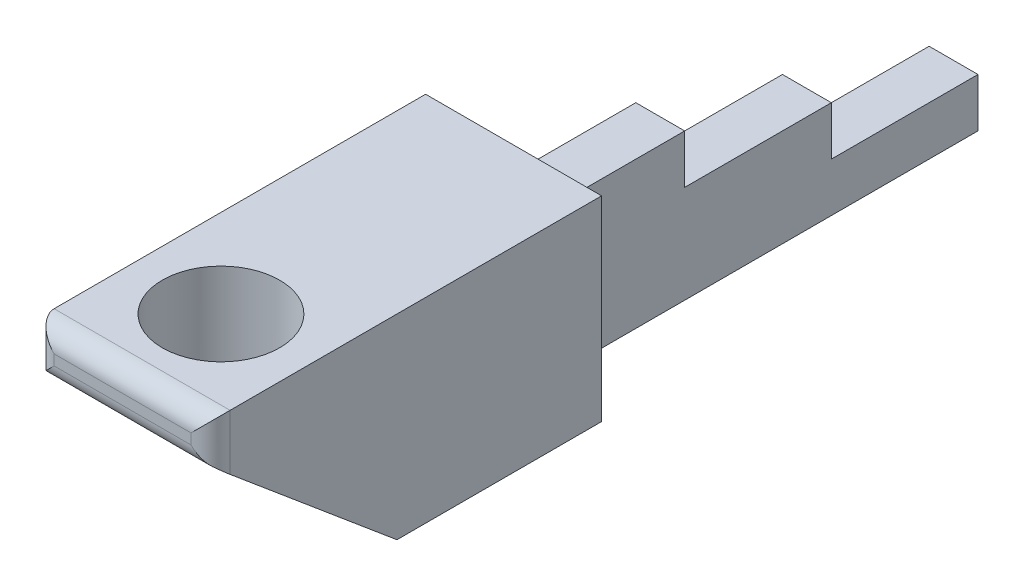
ISO-10303-21;
HEADER;
FILE_DESCRIPTION(('STEP AP214'),'2;1');
FILE_NAME('part.step','',(''),(''),'','','');
FILE_SCHEMA(('AUTOMOTIVE_DESIGN { 1 0 10303 214 1 1 1 1 }'));
ENDSEC;
DATA;
#1=APPLICATION_CONTEXT('core data for automotive mechanical design processes');
#2=APPLICATION_PROTOCOL_DEFINITION('international standard','automotive_design',2000,#1);
#3=PRODUCT_CONTEXT('',#1,'mechanical');
#4=PRODUCT('Part','Part','',(#3));
#5=PRODUCT_RELATED_PRODUCT_CATEGORY('part','',(#4));
#6=PRODUCT_DEFINITION_FORMATION('','',#4);
#7=PRODUCT_DEFINITION_CONTEXT('part definition',#1,'design');
#8=PRODUCT_DEFINITION('design','',#6,#7);
#9=PRODUCT_DEFINITION_SHAPE('','',#8);
#10=(LENGTH_UNIT() NAMED_UNIT(*) SI_UNIT(.MILLI.,.METRE.));
#11=(NAMED_UNIT(*) PLANE_ANGLE_UNIT() SI_UNIT($,.RADIAN.));
#12=(NAMED_UNIT(*) SI_UNIT($,.STERADIAN.) SOLID_ANGLE_UNIT());
#13=UNCERTAINTY_MEASURE_WITH_UNIT(LENGTH_MEASURE(1.E-05),#10,'distance_accuracy_value','');
#14=(GEOMETRIC_REPRESENTATION_CONTEXT(3) GLOBAL_UNCERTAINTY_ASSIGNED_CONTEXT((#13)) GLOBAL_UNIT_ASSIGNED_CONTEXT((#10,
#11,#12)) REPRESENTATION_CONTEXT('',''));
#15=CARTESIAN_POINT('',(0.,0.,0.));
#16=DIRECTION('',(0.,0.,1.));
#17=DIRECTION('',(1.,0.,0.));
#18=AXIS2_PLACEMENT_3D('',#15,#16,#17);
#19=CARTESIAN_POINT('',(9.,0.,-20.9319425184927));
#20=DIRECTION('',(0.,0.,-1.));
#21=DIRECTION('',(0.,1.,0.));
#22=AXIS2_PLACEMENT_3D('',#19,#20,#21);
#23=PLANE('',#22);
#24=DIRECTION('',(-1.,0.,0.));
#25=VECTOR('',#24,1.);
#26=CARTESIAN_POINT('',(2.5,15.,-20.9319425184927));
#27=LINE('',#26,#25);
#28=CARTESIAN_POINT('',(2.5,15.,-20.9319425184927));
#29=VERTEX_POINT('',#28);
#30=CARTESIAN_POINT('',(-2.5,15.,-20.9319425184927));
#31=VERTEX_POINT('',#30);
#32=EDGE_CURVE('E208',#29,#31,#27,.T.);
#33=ORIENTED_EDGE('',*,*,#32,.T.);
#34=DIRECTION('',(0.,-1.,0.));
#35=VECTOR('',#34,1.);
#36=CARTESIAN_POINT('',(-2.5,0.,-20.9319425184927));
#37=LINE('',#36,#35);
#38=CARTESIAN_POINT('',(-2.5,0.,-20.9319425184927));
#39=VERTEX_POINT('',#38);
#40=EDGE_CURVE('E180',#31,#39,#37,.T.);
#41=ORIENTED_EDGE('',*,*,#40,.T.);
#42=DIRECTION('',(-1.,0.,0.));
#43=VECTOR('',#42,1.);
#44=CARTESIAN_POINT('',(9.,0.,-20.9319425184927));
#45=LINE('',#44,#43);
#46=CARTESIAN_POINT('',(-9.,0.,-20.9319425184927));
#47=VERTEX_POINT('',#46);
#48=EDGE_CURVE('E290',#39,#47,#45,.T.);
#49=ORIENTED_EDGE('',*,*,#48,.T.);
#50=DIRECTION('',(0.,-1.,0.));
#51=VECTOR('',#50,1.);
#52=CARTESIAN_POINT('',(-9.,0.,-20.9319425184927));
#53=LINE('',#52,#51);
#54=CARTESIAN_POINT('',(-9.,20.,-20.9319425184927));
#55=VERTEX_POINT('',#54);
#56=EDGE_CURVE('E274',#55,#47,#53,.T.);
#57=ORIENTED_EDGE('',*,*,#56,.F.);
#58=DIRECTION('',(-1.,0.,0.));
#59=VECTOR('',#58,1.);
#60=CARTESIAN_POINT('',(9.,20.,-20.9319425184927));
#61=LINE('',#60,#59);
#62=CARTESIAN_POINT('',(9.,20.,-20.9319425184927));
#63=VERTEX_POINT('',#62);
#64=EDGE_CURVE('E286',#63,#55,#61,.T.);
#65=ORIENTED_EDGE('',*,*,#64,.F.);
#66=DIRECTION('',(0.,-1.,0.));
#67=VECTOR('',#66,1.);
#68=CARTESIAN_POINT('',(9.,0.,-20.9319425184927));
#69=LINE('',#68,#67);
#70=CARTESIAN_POINT('',(9.,0.,-20.9319425184927));
#71=VERTEX_POINT('',#70);
#72=EDGE_CURVE('E259',#63,#71,#69,.T.);
#73=ORIENTED_EDGE('',*,*,#72,.T.);
#74=CARTESIAN_POINT('',(2.5,0.,-20.9319425184927));
#75=VERTEX_POINT('',#74);
#76=EDGE_CURVE('E291',#71,#75,#45,.T.);
#77=ORIENTED_EDGE('',*,*,#76,.T.);
#78=DIRECTION('',(0.,-1.,0.));
#79=VECTOR('',#78,1.);
#80=CARTESIAN_POINT('',(2.5,0.,-20.9319425184927));
#81=LINE('',#80,#79);
#82=EDGE_CURVE('E178',#29,#75,#81,.T.);
#83=ORIENTED_EDGE('',*,*,#82,.F.);
#84=EDGE_LOOP('',(#33,#41,#49,#57,#65,#73,#77,#83));
#85=FACE_BOUND('',#84,.T.);
#86=ADVANCED_FACE('F41',(#85),#23,.T.);
#87=CARTESIAN_POINT('',(9.,0.,0.));
#88=DIRECTION('',(0.,-1.,0.));
#89=DIRECTION('',(0.,0.,-1.));
#90=AXIS2_PLACEMENT_3D('',#87,#88,#89);
#91=PLANE('',#90);
#92=DIRECTION('',(0.,0.,1.));
#93=VECTOR('',#92,1.);
#94=CARTESIAN_POINT('',(-9.,0.,0.));
#95=LINE('',#94,#93);
#96=CARTESIAN_POINT('',(-9.,0.,0.));
#97=VERTEX_POINT('',#96);
#98=EDGE_CURVE('E167',#47,#97,#95,.T.);
#99=ORIENTED_EDGE('',*,*,#98,.F.);
#100=ORIENTED_EDGE('',*,*,#48,.F.);
#101=DIRECTION('',(0.,0.,1.));
#102=VECTOR('',#101,1.);
#103=CARTESIAN_POINT('',(-2.5,0.,0.));
#104=LINE('',#103,#102);
#105=CARTESIAN_POINT('',(-2.5,0.,-65.9319425184927));
#106=VERTEX_POINT('',#105);
#107=EDGE_CURVE('E161',#106,#39,#104,.T.);
#108=ORIENTED_EDGE('',*,*,#107,.F.);
#109=DIRECTION('',(-1.,0.,0.));
#110=VECTOR('',#109,1.);
#111=CARTESIAN_POINT('',(2.5,0.,-65.9319425184927));
#112=LINE('',#111,#110);
#113=CARTESIAN_POINT('',(2.5,0.,-65.9319425184927));
#114=VERTEX_POINT('',#113);
#115=EDGE_CURVE('E154',#114,#106,#112,.T.);
#116=ORIENTED_EDGE('',*,*,#115,.F.);
#117=DIRECTION('',(0.,0.,1.));
#118=VECTOR('',#117,1.);
#119=CARTESIAN_POINT('',(2.5,0.,0.));
#120=LINE('',#119,#118);
#121=EDGE_CURVE('E158',#114,#75,#120,.T.);
#122=ORIENTED_EDGE('',*,*,#121,.T.);
#123=ORIENTED_EDGE('',*,*,#76,.F.);
#124=DIRECTION('',(0.,0.,1.));
#125=VECTOR('',#124,1.);
#126=CARTESIAN_POINT('',(9.,0.,0.));
#127=LINE('',#126,#125);
#128=CARTESIAN_POINT('',(9.,0.,0.));
#129=VERTEX_POINT('',#128);
#130=EDGE_CURVE('E255',#71,#129,#127,.T.);
#131=ORIENTED_EDGE('',*,*,#130,.T.);
#132=DIRECTION('',(-1.,0.,0.));
#133=VECTOR('',#132,1.);
#134=CARTESIAN_POINT('',(9.,0.,0.));
#135=LINE('',#134,#133);
#136=EDGE_CURVE('E270',#129,#97,#135,.T.);
#137=ORIENTED_EDGE('',*,*,#136,.T.);
#138=EDGE_LOOP('',(#99,#100,#108,#116,#122,#123,#131,#137));
#139=FACE_BOUND('',#138,.T.);
#140=ADVANCED_FACE('F157',(#139),#91,.T.);
#141=CARTESIAN_POINT('',(9.,20.,0.));
#142=DIRECTION('',(0.,1.,0.));
#143=DIRECTION('',(0.,0.,1.));
#144=AXIS2_PLACEMENT_3D('',#141,#142,#143);
#145=PLANE('',#144);
#146=CARTESIAN_POINT('',(0.,20.,9.));
#147=DIRECTION('',(0.,1.,0.));
#148=DIRECTION('',(0.,0.,1.));
#149=AXIS2_PLACEMENT_3D('',#146,#147,#148);
#150=CIRCLE('',#149,6.);
#151=CARTESIAN_POINT('',(0.,20.,15.));
#152=VERTEX_POINT('',#151);
#153=EDGE_CURVE('E298',#152,#152,#150,.T.);
#154=ORIENTED_EDGE('',*,*,#153,.F.);
#155=EDGE_LOOP('',(#154));
#156=FACE_BOUND('',#155,.T.);
#157=DIRECTION('',(0.,0.,-1.));
#158=VECTOR('',#157,1.);
#159=CARTESIAN_POINT('',(-9.,20.,0.));
#160=LINE('',#159,#158);
#161=CARTESIAN_POINT('',(-9.,20.,17.0680574815073));
#162=VERTEX_POINT('',#161);
#163=EDGE_CURVE('E278',#162,#55,#160,.T.);
#164=ORIENTED_EDGE('',*,*,#163,.F.);
#165=DIRECTION('',(-1.,0.,0.));
#166=VECTOR('',#165,1.);
#167=CARTESIAN_POINT('',(9.,20.,17.0680574815073));
#168=LINE('',#167,#166);
#169=CARTESIAN_POINT('',(9.,20.,17.0680574815073));
#170=VERTEX_POINT('',#169);
#171=EDGE_CURVE('E311',#162,#170,#168,.F.);
#172=ORIENTED_EDGE('',*,*,#171,.T.);
#173=DIRECTION('',(0.,0.,-1.));
#174=VECTOR('',#173,1.);
#175=CARTESIAN_POINT('',(9.,20.,0.));
#176=LINE('',#175,#174);
#177=EDGE_CURVE('E264',#170,#63,#176,.T.);
#178=ORIENTED_EDGE('',*,*,#177,.T.);
#179=ORIENTED_EDGE('',*,*,#64,.T.);
#180=EDGE_LOOP('',(#164,#172,#178,#179));
#181=FACE_BOUND('',#180,.T.);
#182=ADVANCED_FACE('F347',(#156,#181),#145,.T.);
#183=CARTESIAN_POINT('',(9.,0.,19.0680574815073));
#184=DIRECTION('',(0.,0.,1.));
#185=DIRECTION('',(1.,0.,0.));
#186=AXIS2_PLACEMENT_3D('',#183,#184,#185);
#187=PLANE('',#186);
#188=DIRECTION('',(0.,1.,0.));
#189=VECTOR('',#188,1.);
#190=CARTESIAN_POINT('',(7.,0.,19.0680574815073));
#191=LINE('',#190,#189);
#192=CARTESIAN_POINT('',(7.,16.93261531631,19.0680574815073));
#193=VERTEX_POINT('',#192);
#194=CARTESIAN_POINT('',(7.,18.,19.0680574815073));
#195=VERTEX_POINT('',#194);
#196=EDGE_CURVE('E304',#193,#195,#191,.T.);
#197=ORIENTED_EDGE('',*,*,#196,.T.);
#198=DIRECTION('',(-1.,0.,0.));
#199=VECTOR('',#198,1.);
#200=CARTESIAN_POINT('',(9.,18.,19.0680574815073));
#201=LINE('',#200,#199);
#202=CARTESIAN_POINT('',(-7.,18.,19.0680574815073));
#203=VERTEX_POINT('',#202);
#204=EDGE_CURVE('E307',#195,#203,#201,.T.);
#205=ORIENTED_EDGE('',*,*,#204,.T.);
#206=DIRECTION('',(0.,1.,0.));
#207=VECTOR('',#206,1.);
#208=CARTESIAN_POINT('',(-7.,16.,19.0680574815073));
#209=LINE('',#208,#207);
#210=CARTESIAN_POINT('',(-7.,16.93261531631,19.0680574815073));
#211=VERTEX_POINT('',#210);
#212=EDGE_CURVE('E294',#203,#211,#209,.F.);
#213=ORIENTED_EDGE('',*,*,#212,.T.);
#214=DIRECTION('',(-1.,0.,0.));
#215=VECTOR('',#214,1.);
#216=CARTESIAN_POINT('',(9.,16.93261531631,19.0680574815073));
#217=LINE('',#216,#215);
#218=EDGE_CURVE('E301',#211,#193,#217,.F.);
#219=ORIENTED_EDGE('',*,*,#218,.T.);
#220=EDGE_LOOP('',(#197,#205,#213,#219));
#221=FACE_BOUND('',#220,.T.);
#222=ADVANCED_FACE('F350',(#221),#187,.T.);
#223=CARTESIAN_POINT('',(9.,0.,0.));
#224=DIRECTION('',(0.,-0.766044443118977,0.64278760968654));
#225=DIRECTION('',(0.,-0.64278760968654,-0.766044443118977));
#226=AXIS2_PLACEMENT_3D('',#223,#224,#225);
#227=PLANE('',#226);
#228=CARTESIAN_POINT('',(0.,7.55189668059554,9.));
#229=DIRECTION('',(0.,-0.766044443118977,0.64278760968654));
#230=DIRECTION('',(0.,0.64278760968654,0.766044443118977));
#231=AXIS2_PLACEMENT_3D('',#228,#229,#230);
#232=ELLIPSE('',#231,7.83244373599368,6.);
#233=CARTESIAN_POINT('',(0.,12.5864944676592,15.));
#234=VERTEX_POINT('',#233);
#235=EDGE_CURVE('E212',#234,#234,#232,.T.);
#236=ORIENTED_EDGE('',*,*,#235,.F.);
#237=EDGE_LOOP('',(#236));
#238=FACE_BOUND('',#237,.T.);
#239=DIRECTION('',(0.,0.64278760968654,0.766044443118977));
#240=VECTOR('',#239,1.);
#241=CARTESIAN_POINT('',(9.,0.,0.));
#242=LINE('',#241,#240);
#243=CARTESIAN_POINT('',(9.,14.3218007376454,17.0680574815073));
#244=VERTEX_POINT('',#243);
#245=EDGE_CURVE('E267',#129,#244,#242,.T.);
#246=ORIENTED_EDGE('',*,*,#245,.T.);
#247=CARTESIAN_POINT('',(7.,14.3218007376454,17.0680574815073));
#248=DIRECTION('',(0.,-0.766044443118977,0.64278760968654));
#249=DIRECTION('',(0.,0.64278760968654,0.766044443118977));
#250=AXIS2_PLACEMENT_3D('',#247,#248,#249);
#251=ELLIPSE('',#250,2.61081457866456,2.);
#252=CARTESIAN_POINT('',(8.53208888623795,15.400526430072,18.3536327008804));
#253=VERTEX_POINT('',#252);
#254=EDGE_CURVE('E51',#244,#253,#251,.T.);
#255=ORIENTED_EDGE('',*,*,#254,.T.);
#256=DIRECTION('',(-1.,0.,0.));
#257=VECTOR('',#256,1.);
#258=CARTESIAN_POINT('',(9.,15.400526430072,18.3536327008804));
#259=LINE('',#258,#257);
#260=CARTESIAN_POINT('',(-8.53208888623795,15.400526430072,18.3536327008804));
#261=VERTEX_POINT('',#260);
#262=EDGE_CURVE('E62',#253,#261,#259,.T.);
#263=ORIENTED_EDGE('',*,*,#262,.T.);
#264=CARTESIAN_POINT('',(-7.,14.3218007376454,17.0680574815073));
#265=DIRECTION('',(0.,-0.766044443118977,0.64278760968654));
#266=DIRECTION('',(0.,-0.64278760968654,-0.766044443118977));
#267=AXIS2_PLACEMENT_3D('',#264,#265,#266);
#268=ELLIPSE('',#267,2.61081457866456,2.);
#269=CARTESIAN_POINT('',(-9.,14.3218007376454,17.0680574815073));
#270=VERTEX_POINT('',#269);
#271=EDGE_CURVE('E318',#261,#270,#268,.T.);
#272=ORIENTED_EDGE('',*,*,#271,.T.);
#273=DIRECTION('',(0.,0.64278760968654,0.766044443118977));
#274=VECTOR('',#273,1.);
#275=CARTESIAN_POINT('',(-9.,0.,0.));
#276=LINE('',#275,#274);
#277=EDGE_CURVE('E260',#97,#270,#276,.T.);
#278=ORIENTED_EDGE('',*,*,#277,.F.);
#279=ORIENTED_EDGE('',*,*,#136,.F.);
#280=EDGE_LOOP('',(#246,#255,#263,#272,#278,#279));
#281=FACE_BOUND('',#280,.T.);
#282=ADVANCED_FACE('F374',(#238,#281),#227,.T.);
#283=CARTESIAN_POINT('',(9.,0.,0.));
#284=DIRECTION('',(1.,0.,0.));
#285=DIRECTION('',(0.,0.,-1.));
#286=AXIS2_PLACEMENT_3D('',#283,#284,#285);
#287=PLANE('',#286);
#288=ORIENTED_EDGE('',*,*,#177,.F.);
#289=DIRECTION('',(0.,1.,0.));
#290=VECTOR('',#289,1.);
#291=CARTESIAN_POINT('',(9.,0.,17.0680574815073));
#292=LINE('',#291,#290);
#293=EDGE_CURVE('E315',#170,#244,#292,.F.);
#294=ORIENTED_EDGE('',*,*,#293,.T.);
#295=ORIENTED_EDGE('',*,*,#245,.F.);
#296=ORIENTED_EDGE('',*,*,#130,.F.);
#297=ORIENTED_EDGE('',*,*,#72,.F.);
#298=EDGE_LOOP('',(#288,#294,#295,#296,#297));
#299=FACE_BOUND('',#298,.T.);
#300=ADVANCED_FACE('F371',(#299),#287,.T.);
#301=CARTESIAN_POINT('',(-9.,0.,0.));
#302=DIRECTION('',(1.,0.,0.));
#303=DIRECTION('',(0.,0.,-1.));
#304=AXIS2_PLACEMENT_3D('',#301,#302,#303);
#305=PLANE('',#304);
#306=ORIENTED_EDGE('',*,*,#277,.T.);
#307=DIRECTION('',(0.,1.,0.));
#308=VECTOR('',#307,1.);
#309=CARTESIAN_POINT('',(-9.,20.,17.0680574815073));
#310=LINE('',#309,#308);
#311=EDGE_CURVE('E11',#270,#162,#310,.T.);
#312=ORIENTED_EDGE('',*,*,#311,.T.);
#313=ORIENTED_EDGE('',*,*,#163,.T.);
#314=ORIENTED_EDGE('',*,*,#56,.T.);
#315=ORIENTED_EDGE('',*,*,#98,.T.);
#316=EDGE_LOOP('',(#306,#312,#313,#314,#315));
#317=FACE_BOUND('',#316,.T.);
#318=ADVANCED_FACE('F377',(#317),#305,.F.);
#319=CARTESIAN_POINT('',(2.5,0.,-65.9319425184927));
#320=DIRECTION('',(0.,0.,-1.));
#321=DIRECTION('',(-1.,0.,0.));
#322=AXIS2_PLACEMENT_3D('',#319,#320,#321);
#323=PLANE('',#322);
#324=DIRECTION('',(0.,-1.,0.));
#325=VECTOR('',#324,1.);
#326=CARTESIAN_POINT('',(-2.5,0.,-65.9319425184927));
#327=LINE('',#326,#325);
#328=CARTESIAN_POINT('',(-2.5,5.,-65.9319425184927));
#329=VERTEX_POINT('',#328);
#330=EDGE_CURVE('E211',#329,#106,#327,.T.);
#331=ORIENTED_EDGE('',*,*,#330,.F.);
#332=DIRECTION('',(-1.,0.,0.));
#333=VECTOR('',#332,1.);
#334=CARTESIAN_POINT('',(2.5,5.,-65.9319425184927));
#335=LINE('',#334,#333);
#336=CARTESIAN_POINT('',(2.5,5.,-65.9319425184927));
#337=VERTEX_POINT('',#336);
#338=EDGE_CURVE('E168',#337,#329,#335,.T.);
#339=ORIENTED_EDGE('',*,*,#338,.F.);
#340=DIRECTION('',(0.,-1.,0.));
#341=VECTOR('',#340,1.);
#342=CARTESIAN_POINT('',(2.5,0.,-65.9319425184927));
#343=LINE('',#342,#341);
#344=EDGE_CURVE('E174',#337,#114,#343,.T.);
#345=ORIENTED_EDGE('',*,*,#344,.T.);
#346=ORIENTED_EDGE('',*,*,#115,.T.);
#347=EDGE_LOOP('',(#331,#339,#345,#346));
#348=FACE_BOUND('',#347,.T.);
#349=ADVANCED_FACE('F182',(#348),#323,.T.);
#350=CARTESIAN_POINT('',(2.5,5.,0.));
#351=DIRECTION('',(0.,1.,0.));
#352=DIRECTION('',(0.,0.,1.));
#353=AXIS2_PLACEMENT_3D('',#350,#351,#352);
#354=PLANE('',#353);
#355=DIRECTION('',(0.,0.,-1.));
#356=VECTOR('',#355,1.);
#357=CARTESIAN_POINT('',(-2.5,5.,0.));
#358=LINE('',#357,#356);
#359=CARTESIAN_POINT('',(-2.5,5.,-50.9319425184927));
#360=VERTEX_POINT('',#359);
#361=EDGE_CURVE('E215',#360,#329,#358,.T.);
#362=ORIENTED_EDGE('',*,*,#361,.F.);
#363=DIRECTION('',(-1.,0.,0.));
#364=VECTOR('',#363,1.);
#365=CARTESIAN_POINT('',(2.5,5.,-50.9319425184927));
#366=LINE('',#365,#364);
#367=CARTESIAN_POINT('',(2.5,5.,-50.9319425184927));
#368=VERTEX_POINT('',#367);
#369=EDGE_CURVE('E250',#368,#360,#366,.T.);
#370=ORIENTED_EDGE('',*,*,#369,.F.);
#371=DIRECTION('',(0.,0.,-1.));
#372=VECTOR('',#371,1.);
#373=CARTESIAN_POINT('',(2.5,5.,0.));
#374=LINE('',#373,#372);
#375=EDGE_CURVE('E184',#368,#337,#374,.T.);
#376=ORIENTED_EDGE('',*,*,#375,.T.);
#377=ORIENTED_EDGE('',*,*,#338,.T.);
#378=EDGE_LOOP('',(#362,#370,#376,#377));
#379=FACE_BOUND('',#378,.T.);
#380=ADVANCED_FACE('F385',(#379),#354,.T.);
#381=CARTESIAN_POINT('',(2.5,0.,-50.9319425184927));
#382=DIRECTION('',(0.,0.,-1.));
#383=DIRECTION('',(-1.,0.,0.));
#384=AXIS2_PLACEMENT_3D('',#381,#382,#383);
#385=PLANE('',#384);
#386=DIRECTION('',(0.,-1.,0.));
#387=VECTOR('',#386,1.);
#388=CARTESIAN_POINT('',(-2.5,0.,-50.9319425184927));
#389=LINE('',#388,#387);
#390=CARTESIAN_POINT('',(-2.5,10.,-50.9319425184927));
#391=VERTEX_POINT('',#390);
#392=EDGE_CURVE('E219',#391,#360,#389,.T.);
#393=ORIENTED_EDGE('',*,*,#392,.F.);
#394=DIRECTION('',(-1.,0.,0.));
#395=VECTOR('',#394,1.);
#396=CARTESIAN_POINT('',(2.5,10.,-50.9319425184927));
#397=LINE('',#396,#395);
#398=CARTESIAN_POINT('',(2.5,10.,-50.9319425184927));
#399=VERTEX_POINT('',#398);
#400=EDGE_CURVE('E247',#399,#391,#397,.T.);
#401=ORIENTED_EDGE('',*,*,#400,.F.);
#402=DIRECTION('',(0.,-1.,0.));
#403=VECTOR('',#402,1.);
#404=CARTESIAN_POINT('',(2.5,0.,-50.9319425184927));
#405=LINE('',#404,#403);
#406=EDGE_CURVE('E187',#399,#368,#405,.T.);
#407=ORIENTED_EDGE('',*,*,#406,.T.);
#408=ORIENTED_EDGE('',*,*,#369,.T.);
#409=EDGE_LOOP('',(#393,#401,#407,#408));
#410=FACE_BOUND('',#409,.T.);
#411=ADVANCED_FACE('F430',(#410),#385,.T.);
#412=CARTESIAN_POINT('',(2.5,10.,0.));
#413=DIRECTION('',(0.,1.,0.));
#414=DIRECTION('',(0.,0.,1.));
#415=AXIS2_PLACEMENT_3D('',#412,#413,#414);
#416=PLANE('',#415);
#417=DIRECTION('',(0.,0.,-1.));
#418=VECTOR('',#417,1.);
#419=CARTESIAN_POINT('',(-2.5,10.,0.));
#420=LINE('',#419,#418);
#421=CARTESIAN_POINT('',(-2.5,10.,-35.9319425184927));
#422=VERTEX_POINT('',#421);
#423=EDGE_CURVE('E223',#422,#391,#420,.T.);
#424=ORIENTED_EDGE('',*,*,#423,.F.);
#425=DIRECTION('',(-1.,0.,0.));
#426=VECTOR('',#425,1.);
#427=CARTESIAN_POINT('',(2.5,10.,-35.9319425184927));
#428=LINE('',#427,#426);
#429=CARTESIAN_POINT('',(2.5,10.,-35.9319425184927));
#430=VERTEX_POINT('',#429);
#431=EDGE_CURVE('E244',#430,#422,#428,.T.);
#432=ORIENTED_EDGE('',*,*,#431,.F.);
#433=DIRECTION('',(0.,0.,-1.));
#434=VECTOR('',#433,1.);
#435=CARTESIAN_POINT('',(2.5,10.,0.));
#436=LINE('',#435,#434);
#437=EDGE_CURVE('E194',#430,#399,#436,.T.);
#438=ORIENTED_EDGE('',*,*,#437,.T.);
#439=ORIENTED_EDGE('',*,*,#400,.T.);
#440=EDGE_LOOP('',(#424,#432,#438,#439));
#441=FACE_BOUND('',#440,.T.);
#442=ADVANCED_FACE('F426',(#441),#416,.T.);
#443=CARTESIAN_POINT('',(2.5,0.,-35.9319425184927));
#444=DIRECTION('',(0.,0.,-1.));
#445=DIRECTION('',(-1.,0.,0.));
#446=AXIS2_PLACEMENT_3D('',#443,#444,#445);
#447=PLANE('',#446);
#448=DIRECTION('',(0.,-1.,0.));
#449=VECTOR('',#448,1.);
#450=CARTESIAN_POINT('',(-2.5,0.,-35.9319425184927));
#451=LINE('',#450,#449);
#452=CARTESIAN_POINT('',(-2.5,15.,-35.9319425184927));
#453=VERTEX_POINT('',#452);
#454=EDGE_CURVE('E227',#453,#422,#451,.T.);
#455=ORIENTED_EDGE('',*,*,#454,.F.);
#456=DIRECTION('',(-1.,0.,0.));
#457=VECTOR('',#456,1.);
#458=CARTESIAN_POINT('',(2.5,15.,-35.9319425184927));
#459=LINE('',#458,#457);
#460=CARTESIAN_POINT('',(2.5,15.,-35.9319425184927));
#461=VERTEX_POINT('',#460);
#462=EDGE_CURVE('E241',#461,#453,#459,.T.);
#463=ORIENTED_EDGE('',*,*,#462,.F.);
#464=DIRECTION('',(0.,-1.,0.));
#465=VECTOR('',#464,1.);
#466=CARTESIAN_POINT('',(2.5,0.,-35.9319425184927));
#467=LINE('',#466,#465);
#468=EDGE_CURVE('E198',#461,#430,#467,.T.);
#469=ORIENTED_EDGE('',*,*,#468,.T.);
#470=ORIENTED_EDGE('',*,*,#431,.T.);
#471=EDGE_LOOP('',(#455,#463,#469,#470));
#472=FACE_BOUND('',#471,.T.);
#473=ADVANCED_FACE('F422',(#472),#447,.T.);
#474=CARTESIAN_POINT('',(2.5,15.,0.));
#475=DIRECTION('',(0.,1.,0.));
#476=DIRECTION('',(0.,0.,1.));
#477=AXIS2_PLACEMENT_3D('',#474,#475,#476);
#478=PLANE('',#477);
#479=DIRECTION('',(0.,0.,-1.));
#480=VECTOR('',#479,1.);
#481=CARTESIAN_POINT('',(-2.5,15.,0.));
#482=LINE('',#481,#480);
#483=EDGE_CURVE('E231',#31,#453,#482,.T.);
#484=ORIENTED_EDGE('',*,*,#483,.F.);
#485=ORIENTED_EDGE('',*,*,#32,.F.);
#486=DIRECTION('',(0.,0.,-1.));
#487=VECTOR('',#486,1.);
#488=CARTESIAN_POINT('',(2.5,15.,0.));
#489=LINE('',#488,#487);
#490=EDGE_CURVE('E202',#29,#461,#489,.T.);
#491=ORIENTED_EDGE('',*,*,#490,.T.);
#492=ORIENTED_EDGE('',*,*,#462,.T.);
#493=EDGE_LOOP('',(#484,#485,#491,#492));
#494=FACE_BOUND('',#493,.T.);
#495=ADVANCED_FACE('F418',(#494),#478,.T.);
#496=CARTESIAN_POINT('',(2.5,0.,0.));
#497=DIRECTION('',(1.,0.,0.));
#498=DIRECTION('',(0.,0.,-1.));
#499=AXIS2_PLACEMENT_3D('',#496,#497,#498);
#500=PLANE('',#499);
#501=ORIENTED_EDGE('',*,*,#121,.F.);
#502=ORIENTED_EDGE('',*,*,#344,.F.);
#503=ORIENTED_EDGE('',*,*,#375,.F.);
#504=ORIENTED_EDGE('',*,*,#406,.F.);
#505=ORIENTED_EDGE('',*,*,#437,.F.);
#506=ORIENTED_EDGE('',*,*,#468,.F.);
#507=ORIENTED_EDGE('',*,*,#490,.F.);
#508=ORIENTED_EDGE('',*,*,#82,.T.);
#509=EDGE_LOOP('',(#501,#502,#503,#504,#505,#506,#507,#508));
#510=FACE_BOUND('',#509,.T.);
#511=ADVANCED_FACE('F172',(#510),#500,.T.);
#512=CARTESIAN_POINT('',(-2.5,0.,0.));
#513=DIRECTION('',(1.,0.,0.));
#514=DIRECTION('',(0.,0.,-1.));
#515=AXIS2_PLACEMENT_3D('',#512,#513,#514);
#516=PLANE('',#515);
#517=ORIENTED_EDGE('',*,*,#107,.T.);
#518=ORIENTED_EDGE('',*,*,#40,.F.);
#519=ORIENTED_EDGE('',*,*,#483,.T.);
#520=ORIENTED_EDGE('',*,*,#454,.T.);
#521=ORIENTED_EDGE('',*,*,#423,.T.);
#522=ORIENTED_EDGE('',*,*,#392,.T.);
#523=ORIENTED_EDGE('',*,*,#361,.T.);
#524=ORIENTED_EDGE('',*,*,#330,.T.);
#525=EDGE_LOOP('',(#517,#518,#519,#520,#521,#522,#523,#524));
#526=FACE_BOUND('',#525,.T.);
#527=ADVANCED_FACE('F408',(#526),#516,.F.);
#528=CARTESIAN_POINT('',(0.,-15.,9.));
#529=DIRECTION('',(0.,1.,0.));
#530=DIRECTION('',(0.,0.,1.));
#531=AXIS2_PLACEMENT_3D('',#528,#529,#530);
#532=CYLINDRICAL_SURFACE('',#531,6.);
#533=ORIENTED_EDGE('',*,*,#235,.T.);
#534=EDGE_LOOP('',(#533));
#535=FACE_BOUND('',#534,.T.);
#536=ORIENTED_EDGE('',*,*,#153,.T.);
#537=EDGE_LOOP('',(#536));
#538=FACE_BOUND('',#537,.T.);
#539=ADVANCED_FACE('F345',(#535,#538),#532,.F.);
#540=CARTESIAN_POINT('',(9.,16.93261531631,17.0680574815073));
#541=DIRECTION('',(-1.,0.,0.));
#542=DIRECTION('',(0.,0.,1.));
#543=AXIS2_PLACEMENT_3D('',#540,#541,#542);
#544=CYLINDRICAL_SURFACE('',#543,2.);
#545=CARTESIAN_POINT('',(-7.,16.93261531631,17.0680574815073));
#546=DIRECTION('',(0.707106781186547,-0.707106781186547,0.));
#547=DIRECTION('',(-0.707106781186547,-0.707106781186547,0.));
#548=AXIS2_PLACEMENT_3D('',#545,#546,#547);
#549=ELLIPSE('',#548,2.82842712474619,2.);
#550=EDGE_CURVE('E330',#261,#211,#549,.F.);
#551=ORIENTED_EDGE('',*,*,#550,.F.);
#552=ORIENTED_EDGE('',*,*,#262,.F.);
#553=CARTESIAN_POINT('',(7.,16.93261531631,17.0680574815073));
#554=DIRECTION('',(-0.707106781186547,-0.707106781186547,0.));
#555=DIRECTION('',(-0.707106781186547,0.707106781186547,0.));
#556=AXIS2_PLACEMENT_3D('',#553,#554,#555);
#557=ELLIPSE('',#556,2.82842712474619,2.);
#558=EDGE_CURVE('E45',#193,#253,#557,.F.);
#559=ORIENTED_EDGE('',*,*,#558,.F.);
#560=ORIENTED_EDGE('',*,*,#218,.F.);
#561=EDGE_LOOP('',(#551,#552,#559,#560));
#562=FACE_BOUND('',#561,.T.);
#563=ADVANCED_FACE('F43',(#562),#544,.T.);
#564=CARTESIAN_POINT('',(7.,0.,17.0680574815073));
#565=DIRECTION('',(0.,1.,0.));
#566=DIRECTION('',(0.,0.,1.));
#567=AXIS2_PLACEMENT_3D('',#564,#565,#566);
#568=CYLINDRICAL_SURFACE('',#567,2.);
#569=ORIENTED_EDGE('',*,*,#254,.F.);
#570=ORIENTED_EDGE('',*,*,#293,.F.);
#571=CARTESIAN_POINT('',(7.,18.,17.0680574815073));
#572=DIRECTION('',(-0.707106781186547,0.707106781186547,0.));
#573=DIRECTION('',(0.707106781186547,0.707106781186547,0.));
#574=AXIS2_PLACEMENT_3D('',#571,#572,#573);
#575=ELLIPSE('',#574,2.82842712474619,2.);
#576=EDGE_CURVE('E328',#195,#170,#575,.T.);
#577=ORIENTED_EDGE('',*,*,#576,.F.);
#578=ORIENTED_EDGE('',*,*,#196,.F.);
#579=ORIENTED_EDGE('',*,*,#558,.T.);
#580=EDGE_LOOP('',(#569,#570,#577,#578,#579));
#581=FACE_BOUND('',#580,.T.);
#582=ADVANCED_FACE('F368',(#581),#568,.T.);
#583=CARTESIAN_POINT('',(-7.,0.,17.0680574815073));
#584=DIRECTION('',(0.,-1.,0.));
#585=DIRECTION('',(0.,0.,-1.));
#586=AXIS2_PLACEMENT_3D('',#583,#584,#585);
#587=CYLINDRICAL_SURFACE('',#586,2.);
#588=ORIENTED_EDGE('',*,*,#550,.T.);
#589=ORIENTED_EDGE('',*,*,#212,.F.);
#590=CARTESIAN_POINT('',(-7.,18.,17.0680574815073));
#591=DIRECTION('',(-0.707106781186547,-0.707106781186547,0.));
#592=DIRECTION('',(0.707106781186547,-0.707106781186547,0.));
#593=AXIS2_PLACEMENT_3D('',#590,#591,#592);
#594=ELLIPSE('',#593,2.82842712474619,2.);
#595=EDGE_CURVE('E325',#162,#203,#594,.F.);
#596=ORIENTED_EDGE('',*,*,#595,.F.);
#597=ORIENTED_EDGE('',*,*,#311,.F.);
#598=ORIENTED_EDGE('',*,*,#271,.F.);
#599=EDGE_LOOP('',(#588,#589,#596,#597,#598));
#600=FACE_BOUND('',#599,.T.);
#601=ADVANCED_FACE('F365',(#600),#587,.T.);
#602=CARTESIAN_POINT('',(9.,18.,17.0680574815073));
#603=DIRECTION('',(-1.,0.,0.));
#604=DIRECTION('',(0.,0.,1.));
#605=AXIS2_PLACEMENT_3D('',#602,#603,#604);
#606=CYLINDRICAL_SURFACE('',#605,2.);
#607=ORIENTED_EDGE('',*,*,#576,.T.);
#608=ORIENTED_EDGE('',*,*,#171,.F.);
#609=ORIENTED_EDGE('',*,*,#595,.T.);
#610=ORIENTED_EDGE('',*,*,#204,.F.);
#611=EDGE_LOOP('',(#607,#608,#609,#610));
#612=FACE_BOUND('',#611,.T.);
#613=ADVANCED_FACE('F360',(#612),#606,.T.);
#614=CLOSED_SHELL('',(#86,#140,#182,#222,#282,#300,#318,#349,#380,#411,#442,#473,#495,#511,#527,
#539,#563,#582,#601,#613));
#615=MANIFOLD_SOLID_BREP('B2',#614);
#616=ADVANCED_BREP_SHAPE_REPRESENTATION('',(#18,#615),#14);
#617=SHAPE_DEFINITION_REPRESENTATION(#9,#616);
ENDSEC;
END-ISO-10303-21;
